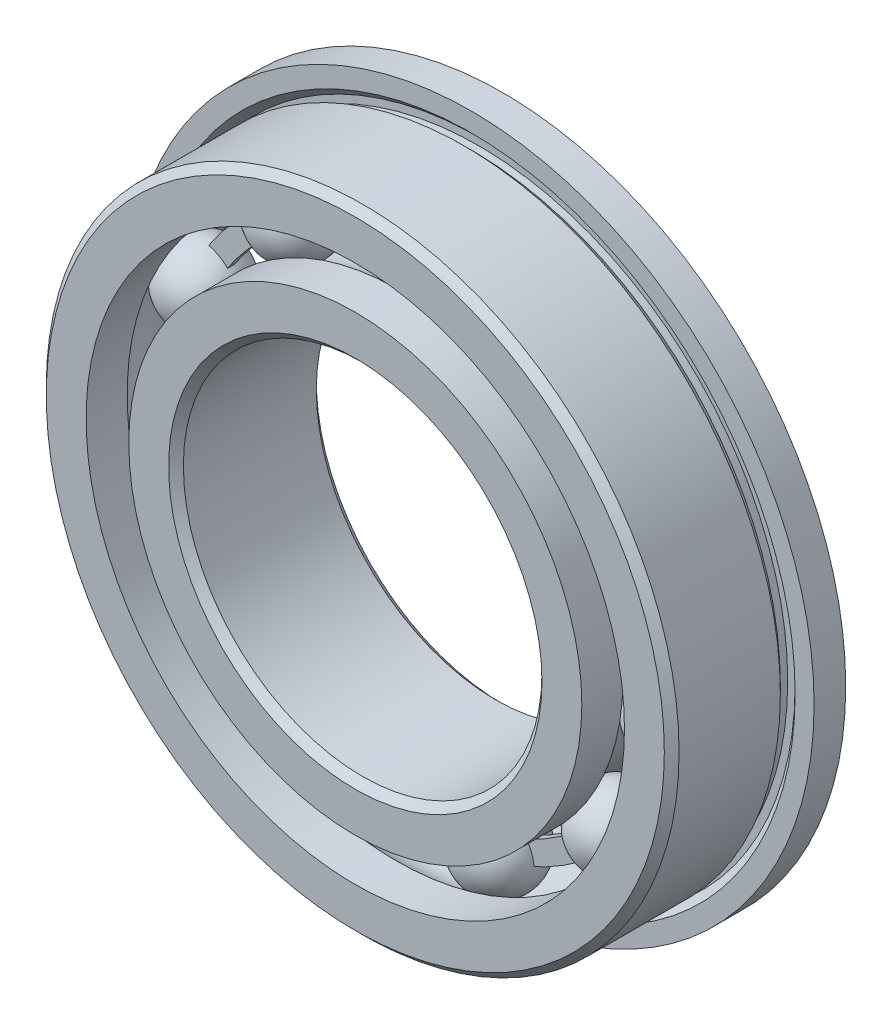
ISO-10303-21;
HEADER;
FILE_DESCRIPTION(('STEP AP214'),'2;1');
FILE_NAME('part.step','',(''),(''),'','','');
FILE_SCHEMA(('AUTOMOTIVE_DESIGN { 1 0 10303 214 1 1 1 1 }'));
ENDSEC;
DATA;
#1=APPLICATION_CONTEXT('core data for automotive mechanical design processes');
#2=APPLICATION_PROTOCOL_DEFINITION('international standard','automotive_design',2000,#1);
#3=PRODUCT_CONTEXT('',#1,'mechanical');
#4=PRODUCT('Part','Part','',(#3));
#5=PRODUCT_RELATED_PRODUCT_CATEGORY('part','',(#4));
#6=PRODUCT_DEFINITION_FORMATION('','',#4);
#7=PRODUCT_DEFINITION_CONTEXT('part definition',#1,'design');
#8=PRODUCT_DEFINITION('design','',#6,#7);
#9=PRODUCT_DEFINITION_SHAPE('','',#8);
#10=(LENGTH_UNIT() NAMED_UNIT(*) SI_UNIT(.MILLI.,.METRE.));
#11=(NAMED_UNIT(*) PLANE_ANGLE_UNIT() SI_UNIT($,.RADIAN.));
#12=(NAMED_UNIT(*) SI_UNIT($,.STERADIAN.) SOLID_ANGLE_UNIT());
#13=UNCERTAINTY_MEASURE_WITH_UNIT(LENGTH_MEASURE(1.E-05),#10,'distance_accuracy_value','');
#14=(GEOMETRIC_REPRESENTATION_CONTEXT(3) GLOBAL_UNCERTAINTY_ASSIGNED_CONTEXT((#13)) GLOBAL_UNIT_ASSIGNED_CONTEXT((#10,
#11,#12)) REPRESENTATION_CONTEXT('',''));
#15=CARTESIAN_POINT('',(0.,0.,0.));
#16=DIRECTION('',(0.,0.,1.));
#17=DIRECTION('',(1.,0.,0.));
#18=AXIS2_PLACEMENT_3D('',#15,#16,#17);
#19=CARTESIAN_POINT('',(-6.35252960510315,9.88472901076646,0.));
#20=DIRECTION('',(0.,0.,1.));
#21=DIRECTION('',(-0.540640817455587,0.841253532831188,0.));
#22=AXIS2_PLACEMENT_3D('',#19,#20,#21);
#23=SPHERICAL_SURFACE('',#22,1.85522286175012);
#24=CARTESIAN_POINT('',(-6.35252960510315,9.88472901076646,1.85522286175012));
#25=VERTEX_POINT('',#24);
#26=VERTEX_LOOP('',#25);
#27=FACE_BOUND('',#26,.T.);
#28=ADVANCED_FACE('F41',(#27),#23,.T.);
#29=CLOSED_SHELL('',(#28));
#30=MANIFOLD_SOLID_BREP('B2',#29);
#31=CARTESIAN_POINT('',(-10.6881759454155,4.88112640277228,0.));
#32=DIRECTION('',(0.,0.,1.));
#33=DIRECTION('',(-0.909631995354514,0.415415013001897,0.));
#34=AXIS2_PLACEMENT_3D('',#31,#32,#33);
#35=SPHERICAL_SURFACE('',#34,1.85522286175012);
#36=CARTESIAN_POINT('',(-10.6881759454155,4.88112640277228,1.85522286175012));
#37=VERTEX_POINT('',#36);
#38=VERTEX_LOOP('',#37);
#39=FACE_BOUND('',#38,.T.);
#40=ADVANCED_FACE('F62',(#39),#35,.T.);
#41=CLOSED_SHELL('',(#40));
#42=MANIFOLD_SOLID_BREP('B6',#41);
#43=CARTESIAN_POINT('',(-11.630401942101,-1.67219934971099,0.));
#44=DIRECTION('',(0.,0.,1.));
#45=DIRECTION('',(-0.989821441880934,-0.142314838273276,0.));
#46=AXIS2_PLACEMENT_3D('',#43,#44,#45);
#47=SPHERICAL_SURFACE('',#46,1.85522286175012);
#48=CARTESIAN_POINT('',(-11.630401942101,-1.67219934971099,1.85522286175012));
#49=VERTEX_POINT('',#48);
#50=VERTEX_LOOP('',#49);
#51=FACE_BOUND('',#50,.T.);
#52=ADVANCED_FACE('F82',(#51),#47,.T.);
#53=CLOSED_SHELL('',(#52));
#54=MANIFOLD_SOLID_BREP('B37',#53);
#55=CARTESIAN_POINT('',(-8.8800574986626,-7.69461362385703,0.));
#56=DIRECTION('',(0.,0.,1.));
#57=DIRECTION('',(-0.755749574354264,-0.654860733945279,0.));
#58=AXIS2_PLACEMENT_3D('',#55,#56,#57);
#59=SPHERICAL_SURFACE('',#58,1.85522286175012);
#60=CARTESIAN_POINT('',(-8.8800574986626,-7.69461362385703,1.85522286175012));
#61=VERTEX_POINT('',#60);
#62=VERTEX_LOOP('',#61);
#63=FACE_BOUND('',#62,.T.);
#64=ADVANCED_FACE('F102',(#63),#59,.T.);
#65=CLOSED_SHELL('',(#64));
#66=MANIFOLD_SOLID_BREP('B58',#65);
#67=CARTESIAN_POINT('',(-3.31035754288688,-11.2740424399703,0.));
#68=DIRECTION('',(0.,0.,1.));
#69=DIRECTION('',(-0.281732556841437,-0.959492973614495,0.));
#70=AXIS2_PLACEMENT_3D('',#67,#68,#69);
#71=SPHERICAL_SURFACE('',#70,1.85522286175012);
#72=CARTESIAN_POINT('',(-3.31035754288688,-11.2740424399703,1.85522286175012));
#73=VERTEX_POINT('',#72);
#74=VERTEX_LOOP('',#73);
#75=FACE_BOUND('',#74,.T.);
#76=ADVANCED_FACE('F123',(#75),#71,.T.);
#77=CLOSED_SHELL('',(#76));
#78=MANIFOLD_SOLID_BREP('B78',#77);
#79=CARTESIAN_POINT('',(3.31035754288673,-11.2740424399704,0.));
#80=DIRECTION('',(0.,0.,1.));
#81=DIRECTION('',(0.281732556841424,-0.959492973614499,0.));
#82=AXIS2_PLACEMENT_3D('',#79,#80,#81);
#83=SPHERICAL_SURFACE('',#82,1.85522286175012);
#84=CARTESIAN_POINT('',(3.31035754288673,-11.2740424399704,1.85522286175012));
#85=VERTEX_POINT('',#84);
#86=VERTEX_LOOP('',#85);
#87=FACE_BOUND('',#86,.T.);
#88=ADVANCED_FACE('F144',(#87),#83,.T.);
#89=CLOSED_SHELL('',(#88));
#90=MANIFOLD_SOLID_BREP('B98',#89);
#91=CARTESIAN_POINT('',(8.8800574986625,-7.69461362385714,0.));
#92=DIRECTION('',(0.,0.,1.));
#93=DIRECTION('',(0.755749574354255,-0.654860733945289,0.));
#94=AXIS2_PLACEMENT_3D('',#91,#92,#93);
#95=SPHERICAL_SURFACE('',#94,1.85522286175012);
#96=CARTESIAN_POINT('',(8.8800574986625,-7.69461362385714,1.85522286175012));
#97=VERTEX_POINT('',#96);
#98=VERTEX_LOOP('',#97);
#99=FACE_BOUND('',#98,.T.);
#100=ADVANCED_FACE('F164',(#99),#95,.T.);
#101=CLOSED_SHELL('',(#100));
#102=MANIFOLD_SOLID_BREP('B119',#101);
#103=CARTESIAN_POINT('',(11.630401942101,-1.67219934971114,0.));
#104=DIRECTION('',(0.,0.,1.));
#105=DIRECTION('',(0.989821441880932,-0.142314838273289,0.));
#106=AXIS2_PLACEMENT_3D('',#103,#104,#105);
#107=SPHERICAL_SURFACE('',#106,1.85522286175012);
#108=CARTESIAN_POINT('',(11.630401942101,-1.67219934971114,1.85522286175012));
#109=VERTEX_POINT('',#108);
#110=VERTEX_LOOP('',#109);
#111=FACE_BOUND('',#110,.T.);
#112=ADVANCED_FACE('F184',(#111),#107,.T.);
#113=CLOSED_SHELL('',(#112));
#114=MANIFOLD_SOLID_BREP('B140',#113);
#115=CARTESIAN_POINT('',(10.6881759454156,4.88112640277214,0.));
#116=DIRECTION('',(0.,0.,1.));
#117=DIRECTION('',(0.90963199535452,0.415415013001884,0.));
#118=AXIS2_PLACEMENT_3D('',#115,#116,#117);
#119=SPHERICAL_SURFACE('',#118,1.85522286175012);
#120=CARTESIAN_POINT('',(10.6881759454156,4.88112640277214,1.85522286175012));
#121=VERTEX_POINT('',#120);
#122=VERTEX_LOOP('',#121);
#123=FACE_BOUND('',#122,.T.);
#124=ADVANCED_FACE('F205',(#123),#119,.T.);
#125=CLOSED_SHELL('',(#124));
#126=MANIFOLD_SOLID_BREP('B160',#125);
#127=CARTESIAN_POINT('',(6.35252960510328,9.88472901076637,0.));
#128=DIRECTION('',(0.,0.,1.));
#129=DIRECTION('',(0.540640817455599,0.841253532831181,0.));
#130=AXIS2_PLACEMENT_3D('',#127,#128,#129);
#131=SPHERICAL_SURFACE('',#130,1.85522286175012);
#132=CARTESIAN_POINT('',(6.35252960510328,9.88472901076637,1.85522286175012));
#133=VERTEX_POINT('',#132);
#134=VERTEX_LOOP('',#133);
#135=FACE_BOUND('',#134,.T.);
#136=ADVANCED_FACE('F226',(#135),#131,.T.);
#137=CLOSED_SHELL('',(#136));
#138=MANIFOLD_SOLID_BREP('B180',#137);
#139=CARTESIAN_POINT('',(0.,11.75,0.));
#140=DIRECTION('',(0.,0.,1.));
#141=DIRECTION('',(0.,1.,0.));
#142=AXIS2_PLACEMENT_3D('',#139,#140,#141);
#143=SPHERICAL_SURFACE('',#142,1.85522286175012);
#144=CARTESIAN_POINT('',(0.,11.75,1.85522286175012));
#145=VERTEX_POINT('',#144);
#146=VERTEX_LOOP('',#145);
#147=FACE_BOUND('',#146,.T.);
#148=ADVANCED_FACE('F249',(#147),#143,.T.);
#149=CLOSED_SHELL('',(#148));
#150=MANIFOLD_SOLID_BREP('B201',#149);
#151=CARTESIAN_POINT('',(0.,12.2554945054945,0.168498168498169));
#152=DIRECTION('',(0.,0.,-1.));
#153=DIRECTION('',(-1.,0.,0.));
#154=AXIS2_PLACEMENT_3D('',#151,#152,#153);
#155=PLANE('',#154);
#156=CARTESIAN_POINT('',(0.,0.,0.168498168498169));
#157=DIRECTION('',(0.,0.,1.));
#158=DIRECTION('',(1.,0.,0.));
#159=AXIS2_PLACEMENT_3D('',#156,#157,#158);
#160=CIRCLE('',#159,11.2445054945055);
#161=CARTESIAN_POINT('',(11.2445054945055,0.,0.168498168498169));
#162=VERTEX_POINT('',#161);
#163=EDGE_CURVE('E248',#162,#162,#160,.T.);
#164=ORIENTED_EDGE('',*,*,#163,.F.);
#165=EDGE_LOOP('',(#164));
#166=FACE_BOUND('',#165,.T.);
#167=CARTESIAN_POINT('',(0.,0.,0.168498168498169));
#168=DIRECTION('',(0.,0.,1.));
#169=DIRECTION('',(1.,0.,0.));
#170=AXIS2_PLACEMENT_3D('',#167,#168,#169);
#171=CIRCLE('',#170,12.2554945054945);
#172=CARTESIAN_POINT('',(12.2554945054945,0.,0.168498168498169));
#173=VERTEX_POINT('',#172);
#174=EDGE_CURVE('E287',#173,#173,#171,.T.);
#175=ORIENTED_EDGE('',*,*,#174,.T.);
#176=EDGE_LOOP('',(#175));
#177=FACE_BOUND('',#176,.T.);
#178=ADVANCED_FACE('F270',(#166,#177),#155,.F.);
#179=CARTESIAN_POINT('',(0.,0.,3.5));
#180=DIRECTION('',(0.,0.,1.));
#181=DIRECTION('',(1.,0.,0.));
#182=AXIS2_PLACEMENT_3D('',#179,#180,#181);
#183=CYLINDRICAL_SURFACE('',#182,11.2445054945055);
#184=CARTESIAN_POINT('',(0.,0.,-0.168498168498168));
#185=DIRECTION('',(0.,0.,1.));
#186=DIRECTION('',(1.,0.,0.));
#187=AXIS2_PLACEMENT_3D('',#184,#185,#186);
#188=CIRCLE('',#187,11.2445054945055);
#189=CARTESIAN_POINT('',(11.2445054945055,0.,-0.168498168498168));
#190=VERTEX_POINT('',#189);
#191=EDGE_CURVE('E277',#190,#190,#188,.T.);
#192=ORIENTED_EDGE('',*,*,#191,.F.);
#193=EDGE_LOOP('',(#192));
#194=FACE_BOUND('',#193,.T.);
#195=ORIENTED_EDGE('',*,*,#163,.T.);
#196=EDGE_LOOP('',(#195));
#197=FACE_BOUND('',#196,.T.);
#198=ADVANCED_FACE('F303',(#194,#197),#183,.F.);
#199=CARTESIAN_POINT('',(0.,12.2554945054945,-0.168498168498168));
#200=DIRECTION('',(0.,0.,1.));
#201=DIRECTION('',(1.,0.,0.));
#202=AXIS2_PLACEMENT_3D('',#199,#200,#201);
#203=PLANE('',#202);
#204=CARTESIAN_POINT('',(0.,0.,-0.168498168498168));
#205=DIRECTION('',(0.,0.,1.));
#206=DIRECTION('',(1.,0.,0.));
#207=AXIS2_PLACEMENT_3D('',#204,#205,#206);
#208=CIRCLE('',#207,12.2554945054945);
#209=CARTESIAN_POINT('',(12.2554945054945,0.,-0.168498168498168));
#210=VERTEX_POINT('',#209);
#211=EDGE_CURVE('E282',#210,#210,#208,.T.);
#212=ORIENTED_EDGE('',*,*,#211,.F.);
#213=EDGE_LOOP('',(#212));
#214=FACE_BOUND('',#213,.T.);
#215=ORIENTED_EDGE('',*,*,#191,.T.);
#216=EDGE_LOOP('',(#215));
#217=FACE_BOUND('',#216,.T.);
#218=ADVANCED_FACE('F298',(#214,#217),#203,.F.);
#219=CARTESIAN_POINT('',(0.,0.,3.5));
#220=DIRECTION('',(0.,0.,1.));
#221=DIRECTION('',(1.,0.,0.));
#222=AXIS2_PLACEMENT_3D('',#219,#220,#221);
#223=CYLINDRICAL_SURFACE('',#222,12.2554945054945);
#224=ORIENTED_EDGE('',*,*,#174,.F.);
#225=EDGE_LOOP('',(#224));
#226=FACE_BOUND('',#225,.T.);
#227=ORIENTED_EDGE('',*,*,#211,.T.);
#228=EDGE_LOOP('',(#227));
#229=FACE_BOUND('',#228,.T.);
#230=ADVANCED_FACE('F295',(#226,#229),#223,.T.);
#231=CLOSED_SHELL('',(#178,#198,#218,#230));
#232=MANIFOLD_SOLID_BREP('B222',#231);
#233=CARTESIAN_POINT('',(0.,10.739010989011,3.5));
#234=DIRECTION('',(0.,0.,-1.));
#235=DIRECTION('',(-1.,0.,0.));
#236=AXIS2_PLACEMENT_3D('',#233,#234,#235);
#237=PLANE('',#236);
#238=CARTESIAN_POINT('',(0.,0.,3.5));
#239=DIRECTION('',(0.,0.,1.));
#240=DIRECTION('',(1.,0.,0.));
#241=AXIS2_PLACEMENT_3D('',#238,#239,#240);
#242=CIRCLE('',#241,8.85);
#243=CARTESIAN_POINT('',(8.85,0.,3.5));
#244=VERTEX_POINT('',#243);
#245=EDGE_CURVE('E382',#244,#244,#242,.T.);
#246=ORIENTED_EDGE('',*,*,#245,.F.);
#247=EDGE_LOOP('',(#246));
#248=FACE_BOUND('',#247,.T.);
#249=CARTESIAN_POINT('',(0.,0.,3.5));
#250=DIRECTION('',(0.,0.,1.));
#251=DIRECTION('',(1.,0.,0.));
#252=AXIS2_PLACEMENT_3D('',#249,#250,#251);
#253=CIRCLE('',#252,10.739010989011);
#254=CARTESIAN_POINT('',(10.739010989011,0.,3.5));
#255=VERTEX_POINT('',#254);
#256=EDGE_CURVE('E269',#255,#255,#253,.T.);
#257=ORIENTED_EDGE('',*,*,#256,.T.);
#258=EDGE_LOOP('',(#257));
#259=FACE_BOUND('',#258,.T.);
#260=ADVANCED_FACE('F346',(#248,#259),#237,.F.);
#261=CARTESIAN_POINT('',(0.,0.,3.5));
#262=DIRECTION('',(0.,0.,1.));
#263=DIRECTION('',(1.,0.,0.));
#264=AXIS2_PLACEMENT_3D('',#261,#262,#263);
#265=CYLINDRICAL_SURFACE('',#264,10.739010989011);
#266=ORIENTED_EDGE('',*,*,#256,.F.);
#267=EDGE_LOOP('',(#266));
#268=FACE_BOUND('',#267,.T.);
#269=CARTESIAN_POINT('',(0.,0.,1.55555555555556));
#270=DIRECTION('',(0.,0.,1.));
#271=DIRECTION('',(1.,0.,0.));
#272=AXIS2_PLACEMENT_3D('',#269,#270,#271);
#273=CIRCLE('',#272,10.739010989011);
#274=CARTESIAN_POINT('',(10.739010989011,0.,1.55555555555556));
#275=VERTEX_POINT('',#274);
#276=EDGE_CURVE('E353',#275,#275,#273,.T.);
#277=ORIENTED_EDGE('',*,*,#276,.T.);
#278=EDGE_LOOP('',(#277));
#279=FACE_BOUND('',#278,.T.);
#280=ADVANCED_FACE('F389',(#268,#279),#265,.T.);
#281=CARTESIAN_POINT('',(0.,0.,0.));
#282=DIRECTION('',(0.,0.,1.));
#283=DIRECTION('',(1.,0.,0.));
#284=AXIS2_PLACEMENT_3D('',#281,#282,#283);
#285=TOROIDAL_SURFACE('',#284,11.75,1.85522286175011);
#286=ORIENTED_EDGE('',*,*,#276,.F.);
#287=EDGE_LOOP('',(#286));
#288=FACE_BOUND('',#287,.T.);
#289=CARTESIAN_POINT('',(0.,0.,-1.55555555555556));
#290=DIRECTION('',(0.,0.,1.));
#291=DIRECTION('',(1.,0.,0.));
#292=AXIS2_PLACEMENT_3D('',#289,#290,#291);
#293=CIRCLE('',#292,10.739010989011);
#294=CARTESIAN_POINT('',(10.739010989011,0.,-1.55555555555556));
#295=VERTEX_POINT('',#294);
#296=EDGE_CURVE('E359',#295,#295,#293,.T.);
#297=ORIENTED_EDGE('',*,*,#296,.T.);
#298=EDGE_LOOP('',(#297));
#299=FACE_BOUND('',#298,.T.);
#300=ADVANCED_FACE('F393',(#288,#299),#285,.F.);
#301=CARTESIAN_POINT('',(0.,0.,3.5));
#302=DIRECTION('',(0.,0.,1.));
#303=DIRECTION('',(1.,0.,0.));
#304=AXIS2_PLACEMENT_3D('',#301,#302,#303);
#305=CYLINDRICAL_SURFACE('',#304,10.739010989011);
#306=ORIENTED_EDGE('',*,*,#296,.F.);
#307=EDGE_LOOP('',(#306));
#308=FACE_BOUND('',#307,.T.);
#309=CARTESIAN_POINT('',(0.,0.,-3.5));
#310=DIRECTION('',(0.,0.,1.));
#311=DIRECTION('',(1.,0.,0.));
#312=AXIS2_PLACEMENT_3D('',#309,#310,#311);
#313=CIRCLE('',#312,10.739010989011);
#314=CARTESIAN_POINT('',(10.739010989011,0.,-3.5));
#315=VERTEX_POINT('',#314);
#316=EDGE_CURVE('E366',#315,#315,#313,.T.);
#317=ORIENTED_EDGE('',*,*,#316,.T.);
#318=EDGE_LOOP('',(#317));
#319=FACE_BOUND('',#318,.T.);
#320=ADVANCED_FACE('F398',(#308,#319),#305,.T.);
#321=CARTESIAN_POINT('',(0.,8.85,-3.5));
#322=DIRECTION('',(0.,0.,1.));
#323=DIRECTION('',(1.,0.,0.));
#324=AXIS2_PLACEMENT_3D('',#321,#322,#323);
#325=PLANE('',#324);
#326=ORIENTED_EDGE('',*,*,#316,.F.);
#327=EDGE_LOOP('',(#326));
#328=FACE_BOUND('',#327,.T.);
#329=CARTESIAN_POINT('',(0.,0.,-3.5));
#330=DIRECTION('',(0.,0.,1.));
#331=DIRECTION('',(1.,0.,0.));
#332=AXIS2_PLACEMENT_3D('',#329,#330,#331);
#333=CIRCLE('',#332,8.85);
#334=CARTESIAN_POINT('',(8.85,0.,-3.5));
#335=VERTEX_POINT('',#334);
#336=EDGE_CURVE('E372',#335,#335,#333,.T.);
#337=ORIENTED_EDGE('',*,*,#336,.T.);
#338=EDGE_LOOP('',(#337));
#339=FACE_BOUND('',#338,.T.);
#340=ADVANCED_FACE('F404',(#328,#339),#325,.F.);
#341=CARTESIAN_POINT('',(0.,0.,-3.15));
#342=DIRECTION('',(0.,0.,-1.));
#343=DIRECTION('',(-1.,0.,0.));
#344=AXIS2_PLACEMENT_3D('',#341,#342,#343);
#345=CONICAL_SURFACE('',#344,8.5,0.785398163397453);
#346=ORIENTED_EDGE('',*,*,#336,.F.);
#347=EDGE_LOOP('',(#346));
#348=FACE_BOUND('',#347,.T.);
#349=CARTESIAN_POINT('',(0.,0.,-3.15));
#350=DIRECTION('',(0.,0.,1.));
#351=DIRECTION('',(1.,0.,0.));
#352=AXIS2_PLACEMENT_3D('',#349,#350,#351);
#353=CIRCLE('',#352,8.5);
#354=CARTESIAN_POINT('',(8.5,0.,-3.15));
#355=VERTEX_POINT('',#354);
#356=EDGE_CURVE('E376',#355,#355,#353,.T.);
#357=ORIENTED_EDGE('',*,*,#356,.T.);
#358=EDGE_LOOP('',(#357));
#359=FACE_BOUND('',#358,.T.);
#360=ADVANCED_FACE('F408',(#348,#359),#345,.F.);
#361=CARTESIAN_POINT('',(0.,0.,3.5));
#362=DIRECTION('',(0.,0.,1.));
#363=DIRECTION('',(1.,0.,0.));
#364=AXIS2_PLACEMENT_3D('',#361,#362,#363);
#365=CYLINDRICAL_SURFACE('',#364,8.5);
#366=ORIENTED_EDGE('',*,*,#356,.F.);
#367=EDGE_LOOP('',(#366));
#368=FACE_BOUND('',#367,.T.);
#369=CARTESIAN_POINT('',(0.,0.,3.14999999999999));
#370=DIRECTION('',(0.,0.,1.));
#371=DIRECTION('',(1.,0.,0.));
#372=AXIS2_PLACEMENT_3D('',#369,#370,#371);
#373=CIRCLE('',#372,8.5);
#374=CARTESIAN_POINT('',(8.5,0.,3.14999999999999));
#375=VERTEX_POINT('',#374);
#376=EDGE_CURVE('E379',#375,#375,#373,.T.);
#377=ORIENTED_EDGE('',*,*,#376,.T.);
#378=EDGE_LOOP('',(#377));
#379=FACE_BOUND('',#378,.T.);
#380=ADVANCED_FACE('F412',(#368,#379),#365,.F.);
#381=CARTESIAN_POINT('',(0.,0.,3.5));
#382=DIRECTION('',(0.,0.,1.));
#383=DIRECTION('',(1.,0.,0.));
#384=AXIS2_PLACEMENT_3D('',#381,#382,#383);
#385=CONICAL_SURFACE('',#384,8.85,0.785398163397443);
#386=ORIENTED_EDGE('',*,*,#376,.F.);
#387=EDGE_LOOP('',(#386));
#388=FACE_BOUND('',#387,.T.);
#389=ORIENTED_EDGE('',*,*,#245,.T.);
#390=EDGE_LOOP('',(#389));
#391=FACE_BOUND('',#390,.T.);
#392=ADVANCED_FACE('F386',(#388,#391),#385,.F.);
#393=CLOSED_SHELL('',(#260,#280,#300,#320,#340,#360,#380,#392));
#394=MANIFOLD_SOLID_BREP('B243',#393);
#395=CARTESIAN_POINT('',(0.,0.,3.5));
#396=DIRECTION('',(0.,0.,1.));
#397=DIRECTION('',(1.,0.,0.));
#398=AXIS2_PLACEMENT_3D('',#395,#396,#397);
#399=CYLINDRICAL_SURFACE('',#398,15.);
#400=CARTESIAN_POINT('',(0.,0.,3.15));
#401=DIRECTION('',(0.,0.,1.));
#402=DIRECTION('',(1.,0.,0.));
#403=AXIS2_PLACEMENT_3D('',#400,#401,#402);
#404=CIRCLE('',#403,15.);
#405=CARTESIAN_POINT('',(15.,0.,3.15));
#406=VERTEX_POINT('',#405);
#407=EDGE_CURVE('E538',#406,#406,#404,.T.);
#408=ORIENTED_EDGE('',*,*,#407,.F.);
#409=EDGE_LOOP('',(#408));
#410=FACE_BOUND('',#409,.T.);
#411=CARTESIAN_POINT('',(0.,0.,-1.65));
#412=DIRECTION('',(0.,0.,1.));
#413=DIRECTION('',(1.,0.,0.));
#414=AXIS2_PLACEMENT_3D('',#411,#412,#413);
#415=CIRCLE('',#414,15.);
#416=CARTESIAN_POINT('',(15.,0.,-1.65));
#417=VERTEX_POINT('',#416);
#418=EDGE_CURVE('E345',#417,#417,#415,.T.);
#419=ORIENTED_EDGE('',*,*,#418,.T.);
#420=EDGE_LOOP('',(#419));
#421=FACE_BOUND('',#420,.T.);
#422=ADVANCED_FACE('F483',(#410,#421),#399,.T.);
#423=CARTESIAN_POINT('',(0.,0.,-2.));
#424=DIRECTION('',(0.,0.,1.));
#425=DIRECTION('',(1.,0.,0.));
#426=AXIS2_PLACEMENT_3D('',#423,#424,#425);
#427=CONICAL_SURFACE('',#426,14.65,0.785398163397438);
#428=ORIENTED_EDGE('',*,*,#418,.F.);
#429=EDGE_LOOP('',(#428));
#430=FACE_BOUND('',#429,.T.);
#431=CARTESIAN_POINT('',(0.,0.,-2.));
#432=DIRECTION('',(0.,0.,1.));
#433=DIRECTION('',(1.,0.,0.));
#434=AXIS2_PLACEMENT_3D('',#431,#432,#433);
#435=CIRCLE('',#434,14.65);
#436=CARTESIAN_POINT('',(14.65,0.,-2.));
#437=VERTEX_POINT('',#436);
#438=EDGE_CURVE('E490',#437,#437,#435,.T.);
#439=ORIENTED_EDGE('',*,*,#438,.T.);
#440=EDGE_LOOP('',(#439));
#441=FACE_BOUND('',#440,.T.);
#442=ADVANCED_FACE('F546',(#430,#441),#427,.T.);
#443=CARTESIAN_POINT('',(0.,0.,3.5));
#444=DIRECTION('',(0.,0.,1.));
#445=DIRECTION('',(1.,0.,0.));
#446=AXIS2_PLACEMENT_3D('',#443,#444,#445);
#447=CYLINDRICAL_SURFACE('',#446,14.65);
#448=ORIENTED_EDGE('',*,*,#438,.F.);
#449=EDGE_LOOP('',(#448));
#450=FACE_BOUND('',#449,.T.);
#451=CARTESIAN_POINT('',(0.,0.,-2.35));
#452=DIRECTION('',(0.,0.,1.));
#453=DIRECTION('',(1.,0.,0.));
#454=AXIS2_PLACEMENT_3D('',#451,#452,#453);
#455=CIRCLE('',#454,14.65);
#456=CARTESIAN_POINT('',(14.65,0.,-2.35));
#457=VERTEX_POINT('',#456);
#458=EDGE_CURVE('E497',#457,#457,#455,.T.);
#459=ORIENTED_EDGE('',*,*,#458,.T.);
#460=EDGE_LOOP('',(#459));
#461=FACE_BOUND('',#460,.T.);
#462=ADVANCED_FACE('F550',(#450,#461),#447,.T.);
#463=CARTESIAN_POINT('',(0.,15.,-2.35));
#464=DIRECTION('',(0.,0.,-1.));
#465=DIRECTION('',(-1.,0.,0.));
#466=AXIS2_PLACEMENT_3D('',#463,#464,#465);
#467=PLANE('',#466);
#468=ORIENTED_EDGE('',*,*,#458,.F.);
#469=EDGE_LOOP('',(#468));
#470=FACE_BOUND('',#469,.T.);
#471=CARTESIAN_POINT('',(0.,0.,-2.35));
#472=DIRECTION('',(0.,0.,1.));
#473=DIRECTION('',(1.,0.,0.));
#474=AXIS2_PLACEMENT_3D('',#471,#472,#473);
#475=CIRCLE('',#474,15.);
#476=CARTESIAN_POINT('',(15.,0.,-2.35));
#477=VERTEX_POINT('',#476);
#478=EDGE_CURVE('E503',#477,#477,#475,.T.);
#479=ORIENTED_EDGE('',*,*,#478,.T.);
#480=EDGE_LOOP('',(#479));
#481=FACE_BOUND('',#480,.T.);
#482=ADVANCED_FACE('F555',(#470,#481),#467,.F.);
#483=CARTESIAN_POINT('',(0.,0.,-2.));
#484=DIRECTION('',(0.,0.,1.));
#485=DIRECTION('',(1.,0.,0.));
#486=AXIS2_PLACEMENT_3D('',#483,#484,#485);
#487=CONICAL_SURFACE('',#486,15.35,0.785398163397443);
#488=ORIENTED_EDGE('',*,*,#478,.F.);
#489=EDGE_LOOP('',(#488));
#490=FACE_BOUND('',#489,.T.);
#491=CARTESIAN_POINT('',(0.,0.,-2.));
#492=DIRECTION('',(0.,0.,1.));
#493=DIRECTION('',(1.,0.,0.));
#494=AXIS2_PLACEMENT_3D('',#491,#492,#493);
#495=CIRCLE('',#494,15.35);
#496=CARTESIAN_POINT('',(15.35,0.,-2.));
#497=VERTEX_POINT('',#496);
#498=EDGE_CURVE('E508',#497,#497,#495,.T.);
#499=ORIENTED_EDGE('',*,*,#498,.T.);
#500=EDGE_LOOP('',(#499));
#501=FACE_BOUND('',#500,.T.);
#502=ADVANCED_FACE('F561',(#490,#501),#487,.F.);
#503=CARTESIAN_POINT('',(0.,16.25,-2.));
#504=DIRECTION('',(0.,0.,-1.));
#505=DIRECTION('',(-1.,0.,0.));
#506=AXIS2_PLACEMENT_3D('',#503,#504,#505);
#507=PLANE('',#506);
#508=ORIENTED_EDGE('',*,*,#498,.F.);
#509=EDGE_LOOP('',(#508));
#510=FACE_BOUND('',#509,.T.);
#511=CARTESIAN_POINT('',(0.,0.,-2.));
#512=DIRECTION('',(0.,0.,1.));
#513=DIRECTION('',(1.,0.,0.));
#514=AXIS2_PLACEMENT_3D('',#511,#512,#513);
#515=CIRCLE('',#514,16.25);
#516=CARTESIAN_POINT('',(16.25,0.,-2.));
#517=VERTEX_POINT('',#516);
#518=EDGE_CURVE('E511',#517,#517,#515,.T.);
#519=ORIENTED_EDGE('',*,*,#518,.T.);
#520=EDGE_LOOP('',(#519));
#521=FACE_BOUND('',#520,.T.);
#522=ADVANCED_FACE('F565',(#510,#521),#507,.F.);
#523=CARTESIAN_POINT('',(0.,0.,3.5));
#524=DIRECTION('',(0.,0.,1.));
#525=DIRECTION('',(1.,0.,0.));
#526=AXIS2_PLACEMENT_3D('',#523,#524,#525);
#527=CYLINDRICAL_SURFACE('',#526,16.25);
#528=ORIENTED_EDGE('',*,*,#518,.F.);
#529=EDGE_LOOP('',(#528));
#530=FACE_BOUND('',#529,.T.);
#531=CARTESIAN_POINT('',(0.,0.,-3.5));
#532=DIRECTION('',(0.,0.,1.));
#533=DIRECTION('',(1.,0.,0.));
#534=AXIS2_PLACEMENT_3D('',#531,#532,#533);
#535=CIRCLE('',#534,16.25);
#536=CARTESIAN_POINT('',(16.25,0.,-3.5));
#537=VERTEX_POINT('',#536);
#538=EDGE_CURVE('E515',#537,#537,#535,.T.);
#539=ORIENTED_EDGE('',*,*,#538,.T.);
#540=EDGE_LOOP('',(#539));
#541=FACE_BOUND('',#540,.T.);
#542=ADVANCED_FACE('F569',(#530,#541),#527,.T.);
#543=CARTESIAN_POINT('',(0.,14.65,-3.5));
#544=DIRECTION('',(0.,0.,1.));
#545=DIRECTION('',(1.,0.,0.));
#546=AXIS2_PLACEMENT_3D('',#543,#544,#545);
#547=PLANE('',#546);
#548=ORIENTED_EDGE('',*,*,#538,.F.);
#549=EDGE_LOOP('',(#548));
#550=FACE_BOUND('',#549,.T.);
#551=CARTESIAN_POINT('',(0.,0.,-3.5));
#552=DIRECTION('',(0.,0.,1.));
#553=DIRECTION('',(1.,0.,0.));
#554=AXIS2_PLACEMENT_3D('',#551,#552,#553);
#555=CIRCLE('',#554,12.760989010989);
#556=CARTESIAN_POINT('',(12.760989010989,0.,-3.5));
#557=VERTEX_POINT('',#556);
#558=EDGE_CURVE('E518',#557,#557,#555,.T.);
#559=ORIENTED_EDGE('',*,*,#558,.T.);
#560=EDGE_LOOP('',(#559));
#561=FACE_BOUND('',#560,.T.);
#562=ADVANCED_FACE('F573',(#550,#561),#547,.F.);
#563=CARTESIAN_POINT('',(0.,0.,3.5));
#564=DIRECTION('',(0.,0.,1.));
#565=DIRECTION('',(1.,0.,0.));
#566=AXIS2_PLACEMENT_3D('',#563,#564,#565);
#567=CYLINDRICAL_SURFACE('',#566,12.760989010989);
#568=ORIENTED_EDGE('',*,*,#558,.F.);
#569=EDGE_LOOP('',(#568));
#570=FACE_BOUND('',#569,.T.);
#571=CARTESIAN_POINT('',(0.,0.,-1.55555555555556));
#572=DIRECTION('',(0.,0.,1.));
#573=DIRECTION('',(1.,0.,0.));
#574=AXIS2_PLACEMENT_3D('',#571,#572,#573);
#575=CIRCLE('',#574,12.760989010989);
#576=CARTESIAN_POINT('',(12.760989010989,0.,-1.55555555555556));
#577=VERTEX_POINT('',#576);
#578=EDGE_CURVE('E522',#577,#577,#575,.T.);
#579=ORIENTED_EDGE('',*,*,#578,.T.);
#580=EDGE_LOOP('',(#579));
#581=FACE_BOUND('',#580,.T.);
#582=ADVANCED_FACE('F577',(#570,#581),#567,.F.);
#583=CARTESIAN_POINT('',(0.,0.,0.));
#584=DIRECTION('',(0.,0.,1.));
#585=DIRECTION('',(1.,0.,0.));
#586=AXIS2_PLACEMENT_3D('',#583,#584,#585);
#587=TOROIDAL_SURFACE('',#586,11.75,1.85522286175012);
#588=ORIENTED_EDGE('',*,*,#578,.F.);
#589=EDGE_LOOP('',(#588));
#590=FACE_BOUND('',#589,.T.);
#591=CARTESIAN_POINT('',(0.,0.,1.55555555555556));
#592=DIRECTION('',(0.,0.,1.));
#593=DIRECTION('',(1.,0.,0.));
#594=AXIS2_PLACEMENT_3D('',#591,#592,#593);
#595=CIRCLE('',#594,12.760989010989);
#596=CARTESIAN_POINT('',(12.760989010989,0.,1.55555555555556));
#597=VERTEX_POINT('',#596);
#598=EDGE_CURVE('E526',#597,#597,#595,.T.);
#599=ORIENTED_EDGE('',*,*,#598,.T.);
#600=EDGE_LOOP('',(#599));
#601=FACE_BOUND('',#600,.T.);
#602=ADVANCED_FACE('F581',(#590,#601),#587,.F.);
#603=CARTESIAN_POINT('',(0.,0.,3.5));
#604=DIRECTION('',(0.,0.,1.));
#605=DIRECTION('',(1.,0.,0.));
#606=AXIS2_PLACEMENT_3D('',#603,#604,#605);
#607=CYLINDRICAL_SURFACE('',#606,12.760989010989);
#608=ORIENTED_EDGE('',*,*,#598,.F.);
#609=EDGE_LOOP('',(#608));
#610=FACE_BOUND('',#609,.T.);
#611=CARTESIAN_POINT('',(0.,0.,3.5));
#612=DIRECTION('',(0.,0.,1.));
#613=DIRECTION('',(1.,0.,0.));
#614=AXIS2_PLACEMENT_3D('',#611,#612,#613);
#615=CIRCLE('',#614,12.760989010989);
#616=CARTESIAN_POINT('',(12.760989010989,0.,3.5));
#617=VERTEX_POINT('',#616);
#618=EDGE_CURVE('E530',#617,#617,#615,.T.);
#619=ORIENTED_EDGE('',*,*,#618,.T.);
#620=EDGE_LOOP('',(#619));
#621=FACE_BOUND('',#620,.T.);
#622=ADVANCED_FACE('F585',(#610,#621),#607,.F.);
#623=CARTESIAN_POINT('',(0.,14.65,3.5));
#624=DIRECTION('',(0.,0.,-1.));
#625=DIRECTION('',(-1.,0.,0.));
#626=AXIS2_PLACEMENT_3D('',#623,#624,#625);
#627=PLANE('',#626);
#628=ORIENTED_EDGE('',*,*,#618,.F.);
#629=EDGE_LOOP('',(#628));
#630=FACE_BOUND('',#629,.T.);
#631=CARTESIAN_POINT('',(0.,0.,3.5));
#632=DIRECTION('',(0.,0.,1.));
#633=DIRECTION('',(1.,0.,0.));
#634=AXIS2_PLACEMENT_3D('',#631,#632,#633);
#635=CIRCLE('',#634,14.65);
#636=CARTESIAN_POINT('',(14.65,0.,3.5));
#637=VERTEX_POINT('',#636);
#638=EDGE_CURVE('E534',#637,#637,#635,.T.);
#639=ORIENTED_EDGE('',*,*,#638,.T.);
#640=EDGE_LOOP('',(#639));
#641=FACE_BOUND('',#640,.T.);
#642=ADVANCED_FACE('F589',(#630,#641),#627,.F.);
#643=CARTESIAN_POINT('',(0.,0.,3.15));
#644=DIRECTION('',(0.,0.,-1.));
#645=DIRECTION('',(-1.,0.,0.));
#646=AXIS2_PLACEMENT_3D('',#643,#644,#645);
#647=CONICAL_SURFACE('',#646,15.,0.785398163397453);
#648=ORIENTED_EDGE('',*,*,#638,.F.);
#649=EDGE_LOOP('',(#648));
#650=FACE_BOUND('',#649,.T.);
#651=ORIENTED_EDGE('',*,*,#407,.T.);
#652=EDGE_LOOP('',(#651));
#653=FACE_BOUND('',#652,.T.);
#654=ADVANCED_FACE('F543',(#650,#653),#647,.T.);
#655=CLOSED_SHELL('',(#422,#442,#462,#482,#502,#522,#542,#562,#582,#602,#622,#642,#654));
#656=MANIFOLD_SOLID_BREP('B264',#655);
#657=ADVANCED_BREP_SHAPE_REPRESENTATION('',(#18,#30,#42,#54,#66,#78,#90,#102,#114,#126,#138,
#150,#232,#394,#656),#14);
#658=SHAPE_DEFINITION_REPRESENTATION(#9,#657);
ENDSEC;
END-ISO-10303-21;
